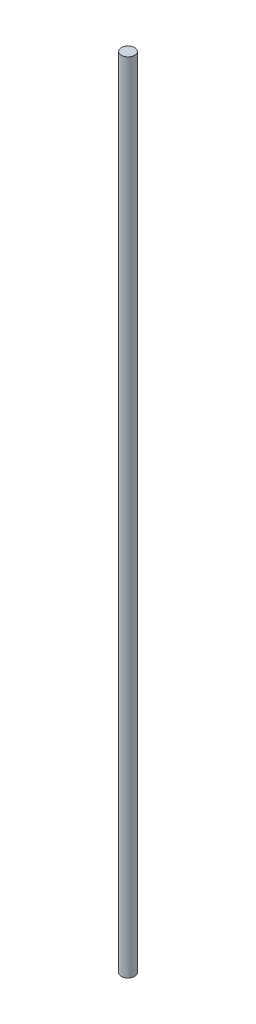
ISO-10303-21;
HEADER;
FILE_DESCRIPTION(('STEP AP214'),'2;1');
FILE_NAME('part.step','',(''),(''),'','','');
FILE_SCHEMA(('AUTOMOTIVE_DESIGN { 1 0 10303 214 1 1 1 1 }'));
ENDSEC;
DATA;
#1=APPLICATION_CONTEXT('core data for automotive mechanical design processes');
#2=APPLICATION_PROTOCOL_DEFINITION('international standard','automotive_design',2000,#1);
#3=PRODUCT_CONTEXT('',#1,'mechanical');
#4=PRODUCT('Part','Part','',(#3));
#5=PRODUCT_RELATED_PRODUCT_CATEGORY('part','',(#4));
#6=PRODUCT_DEFINITION_FORMATION('','',#4);
#7=PRODUCT_DEFINITION_CONTEXT('part definition',#1,'design');
#8=PRODUCT_DEFINITION('design','',#6,#7);
#9=PRODUCT_DEFINITION_SHAPE('','',#8);
#10=(LENGTH_UNIT() NAMED_UNIT(*) SI_UNIT(.MILLI.,.METRE.));
#11=(NAMED_UNIT(*) PLANE_ANGLE_UNIT() SI_UNIT($,.RADIAN.));
#12=(NAMED_UNIT(*) SI_UNIT($,.STERADIAN.) SOLID_ANGLE_UNIT());
#13=UNCERTAINTY_MEASURE_WITH_UNIT(LENGTH_MEASURE(1.E-05),#10,'distance_accuracy_value','');
#14=(GEOMETRIC_REPRESENTATION_CONTEXT(3) GLOBAL_UNCERTAINTY_ASSIGNED_CONTEXT((#13)) GLOBAL_UNIT_ASSIGNED_CONTEXT((#10,
#11,#12)) REPRESENTATION_CONTEXT('',''));
#15=CARTESIAN_POINT('',(0.,0.,0.));
#16=DIRECTION('',(0.,0.,1.));
#17=DIRECTION('',(1.,0.,0.));
#18=AXIS2_PLACEMENT_3D('',#15,#16,#17);
#19=CARTESIAN_POINT('',(0.,600.,0.));
#20=DIRECTION('',(0.,-1.,0.));
#21=DIRECTION('',(0.,0.,-1.));
#22=AXIS2_PLACEMENT_3D('',#19,#20,#21);
#23=CYLINDRICAL_SURFACE('',#22,5.);
#24=CARTESIAN_POINT('',(0.,600.,0.));
#25=DIRECTION('',(0.,1.,0.));
#26=DIRECTION('',(0.,0.,1.));
#27=AXIS2_PLACEMENT_3D('',#24,#25,#26);
#28=CIRCLE('',#27,5.);
#29=CARTESIAN_POINT('',(0.,600.,5.));
#30=VERTEX_POINT('',#29);
#31=EDGE_CURVE('E10',#30,#30,#28,.T.);
#32=ORIENTED_EDGE('',*,*,#31,.F.);
#33=EDGE_LOOP('',(#32));
#34=FACE_BOUND('',#33,.T.);
#35=CARTESIAN_POINT('',(0.,0.,0.));
#36=DIRECTION('',(0.,1.,0.));
#37=DIRECTION('',(0.,0.,1.));
#38=AXIS2_PLACEMENT_3D('',#35,#36,#37);
#39=CIRCLE('',#38,5.);
#40=CARTESIAN_POINT('',(0.,0.,5.));
#41=VERTEX_POINT('',#40);
#42=EDGE_CURVE('E35',#41,#41,#39,.T.);
#43=ORIENTED_EDGE('',*,*,#42,.T.);
#44=EDGE_LOOP('',(#43));
#45=FACE_BOUND('',#44,.T.);
#46=ADVANCED_FACE('F32',(#34,#45),#23,.T.);
#47=CARTESIAN_POINT('',(0.,600.,0.));
#48=DIRECTION('',(0.,1.,0.));
#49=DIRECTION('',(0.,0.,1.));
#50=AXIS2_PLACEMENT_3D('',#47,#48,#49);
#51=PLANE('',#50);
#52=ORIENTED_EDGE('',*,*,#31,.T.);
#53=EDGE_LOOP('',(#52));
#54=FACE_BOUND('',#53,.T.);
#55=ADVANCED_FACE('F47',(#54),#51,.T.);
#56=CARTESIAN_POINT('',(0.,0.,0.));
#57=DIRECTION('',(0.,1.,0.));
#58=DIRECTION('',(0.,0.,1.));
#59=AXIS2_PLACEMENT_3D('',#56,#57,#58);
#60=PLANE('',#59);
#61=ORIENTED_EDGE('',*,*,#42,.F.);
#62=EDGE_LOOP('',(#61));
#63=FACE_BOUND('',#62,.T.);
#64=ADVANCED_FACE('F45',(#63),#60,.F.);
#65=CLOSED_SHELL('',(#46,#55,#64));
#66=MANIFOLD_SOLID_BREP('B2',#65);
#67=ADVANCED_BREP_SHAPE_REPRESENTATION('',(#18,#66),#14);
#68=SHAPE_DEFINITION_REPRESENTATION(#9,#67);
ENDSEC;
END-ISO-10303-21;
